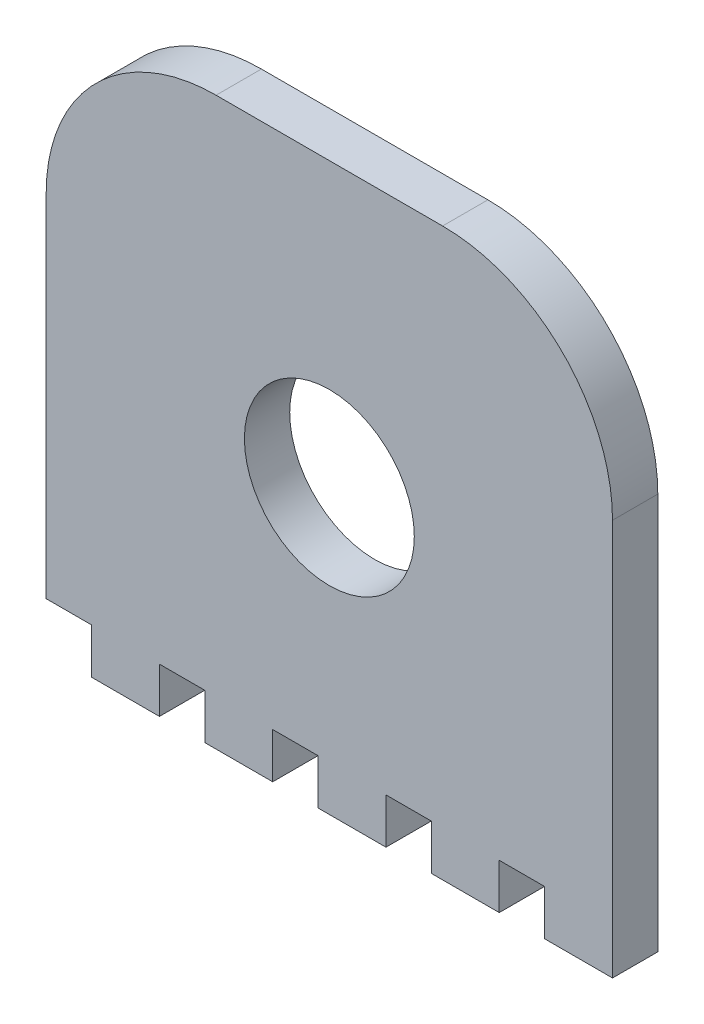
ISO-10303-21;
HEADER;
FILE_DESCRIPTION(('STEP AP214'),'2;1');
FILE_NAME('part.step','',(''),(''),'','','');
FILE_SCHEMA(('AUTOMOTIVE_DESIGN { 1 0 10303 214 1 1 1 1 }'));
ENDSEC;
DATA;
#1=APPLICATION_CONTEXT('core data for automotive mechanical design processes');
#2=APPLICATION_PROTOCOL_DEFINITION('international standard','automotive_design',2000,#1);
#3=PRODUCT_CONTEXT('',#1,'mechanical');
#4=PRODUCT('Part','Part','',(#3));
#5=PRODUCT_RELATED_PRODUCT_CATEGORY('part','',(#4));
#6=PRODUCT_DEFINITION_FORMATION('','',#4);
#7=PRODUCT_DEFINITION_CONTEXT('part definition',#1,'design');
#8=PRODUCT_DEFINITION('design','',#6,#7);
#9=PRODUCT_DEFINITION_SHAPE('','',#8);
#10=(LENGTH_UNIT() NAMED_UNIT(*) SI_UNIT(.MILLI.,.METRE.));
#11=(NAMED_UNIT(*) PLANE_ANGLE_UNIT() SI_UNIT($,.RADIAN.));
#12=(NAMED_UNIT(*) SI_UNIT($,.STERADIAN.) SOLID_ANGLE_UNIT());
#13=UNCERTAINTY_MEASURE_WITH_UNIT(LENGTH_MEASURE(1.E-05),#10,'distance_accuracy_value','');
#14=(GEOMETRIC_REPRESENTATION_CONTEXT(3) GLOBAL_UNCERTAINTY_ASSIGNED_CONTEXT((#13)) GLOBAL_UNIT_ASSIGNED_CONTEXT((#10,
#11,#12)) REPRESENTATION_CONTEXT('',''));
#15=CARTESIAN_POINT('',(0.,0.,0.));
#16=DIRECTION('',(0.,0.,1.));
#17=DIRECTION('',(1.,0.,0.));
#18=AXIS2_PLACEMENT_3D('',#15,#16,#17);
#19=CARTESIAN_POINT('',(-25.,-25.,4.));
#20=DIRECTION('',(0.,1.,0.));
#21=DIRECTION('',(0.,0.,1.));
#22=AXIS2_PLACEMENT_3D('',#19,#20,#21);
#23=PLANE('',#22);
#24=DIRECTION('',(0.,0.,-1.));
#25=VECTOR('',#24,1.);
#26=CARTESIAN_POINT('',(-15.,-25.,4.));
#27=LINE('',#26,#25);
#28=CARTESIAN_POINT('',(-15.,-25.,4.));
#29=VERTEX_POINT('',#28);
#30=CARTESIAN_POINT('',(-15.,-25.,0.));
#31=VERTEX_POINT('',#30);
#32=EDGE_CURVE('E199',#29,#31,#27,.T.);
#33=ORIENTED_EDGE('',*,*,#32,.F.);
#34=DIRECTION('',(1.,0.,0.));
#35=VECTOR('',#34,1.);
#36=CARTESIAN_POINT('',(-25.,-25.,4.));
#37=LINE('',#36,#35);
#38=CARTESIAN_POINT('',(-21.,-25.,4.));
#39=VERTEX_POINT('',#38);
#40=EDGE_CURVE('E212',#39,#29,#37,.T.);
#41=ORIENTED_EDGE('',*,*,#40,.F.);
#42=DIRECTION('',(0.,0.,-1.));
#43=VECTOR('',#42,1.);
#44=CARTESIAN_POINT('',(-21.,-25.,4.));
#45=LINE('',#44,#43);
#46=CARTESIAN_POINT('',(-21.,-25.,0.));
#47=VERTEX_POINT('',#46);
#48=EDGE_CURVE('E245',#39,#47,#45,.T.);
#49=ORIENTED_EDGE('',*,*,#48,.T.);
#50=DIRECTION('',(1.,0.,0.));
#51=VECTOR('',#50,1.);
#52=CARTESIAN_POINT('',(-25.,-25.,0.));
#53=LINE('',#52,#51);
#54=EDGE_CURVE('E214',#47,#31,#53,.T.);
#55=ORIENTED_EDGE('',*,*,#54,.T.);
#56=EDGE_LOOP('',(#33,#41,#49,#55));
#57=FACE_BOUND('',#56,.T.);
#58=ADVANCED_FACE('F32',(#57),#23,.F.);
#59=DIRECTION('',(0.,0.,-1.));
#60=VECTOR('',#59,1.);
#61=CARTESIAN_POINT('',(-11.,-25.,4.));
#62=LINE('',#61,#60);
#63=CARTESIAN_POINT('',(-11.,-25.,4.));
#64=VERTEX_POINT('',#63);
#65=CARTESIAN_POINT('',(-11.,-25.,0.));
#66=VERTEX_POINT('',#65);
#67=EDGE_CURVE('E216',#64,#66,#62,.T.);
#68=ORIENTED_EDGE('',*,*,#67,.T.);
#69=CARTESIAN_POINT('',(-5.,-25.,0.));
#70=VERTEX_POINT('',#69);
#71=EDGE_CURVE('E419',#66,#70,#53,.T.);
#72=ORIENTED_EDGE('',*,*,#71,.T.);
#73=DIRECTION('',(0.,0.,-1.));
#74=VECTOR('',#73,1.);
#75=CARTESIAN_POINT('',(-5.,-25.,4.));
#76=LINE('',#75,#74);
#77=CARTESIAN_POINT('',(-5.,-25.,4.));
#78=VERTEX_POINT('',#77);
#79=EDGE_CURVE('E313',#78,#70,#76,.T.);
#80=ORIENTED_EDGE('',*,*,#79,.F.);
#81=EDGE_CURVE('E223',#64,#78,#37,.T.);
#82=ORIENTED_EDGE('',*,*,#81,.F.);
#83=EDGE_LOOP('',(#68,#72,#80,#82));
#84=FACE_BOUND('',#83,.T.);
#85=ADVANCED_FACE('F377',(#84),#23,.F.);
#86=DIRECTION('',(0.,0.,-1.));
#87=VECTOR('',#86,1.);
#88=CARTESIAN_POINT('',(-0.999999999999997,-25.,4.));
#89=LINE('',#88,#87);
#90=CARTESIAN_POINT('',(-0.999999999999997,-25.,4.));
#91=VERTEX_POINT('',#90);
#92=CARTESIAN_POINT('',(-0.999999999999997,-25.,0.));
#93=VERTEX_POINT('',#92);
#94=EDGE_CURVE('E316',#91,#93,#89,.T.);
#95=ORIENTED_EDGE('',*,*,#94,.T.);
#96=CARTESIAN_POINT('',(5.,-25.,0.));
#97=VERTEX_POINT('',#96);
#98=EDGE_CURVE('E465',#93,#97,#53,.T.);
#99=ORIENTED_EDGE('',*,*,#98,.T.);
#100=DIRECTION('',(0.,0.,-1.));
#101=VECTOR('',#100,1.);
#102=CARTESIAN_POINT('',(5.,-25.,4.));
#103=LINE('',#102,#101);
#104=CARTESIAN_POINT('',(5.,-25.,4.));
#105=VERTEX_POINT('',#104);
#106=EDGE_CURVE('E288',#105,#97,#103,.T.);
#107=ORIENTED_EDGE('',*,*,#106,.F.);
#108=EDGE_CURVE('E230',#91,#105,#37,.T.);
#109=ORIENTED_EDGE('',*,*,#108,.F.);
#110=EDGE_LOOP('',(#95,#99,#107,#109));
#111=FACE_BOUND('',#110,.T.);
#112=ADVANCED_FACE('F381',(#111),#23,.F.);
#113=DIRECTION('',(0.,0.,-1.));
#114=VECTOR('',#113,1.);
#115=CARTESIAN_POINT('',(9.,-25.,4.));
#116=LINE('',#115,#114);
#117=CARTESIAN_POINT('',(9.,-25.,4.));
#118=VERTEX_POINT('',#117);
#119=CARTESIAN_POINT('',(9.,-25.,0.));
#120=VERTEX_POINT('',#119);
#121=EDGE_CURVE('E291',#118,#120,#116,.T.);
#122=ORIENTED_EDGE('',*,*,#121,.T.);
#123=CARTESIAN_POINT('',(15.,-25.,0.));
#124=VERTEX_POINT('',#123);
#125=EDGE_CURVE('E482',#120,#124,#53,.T.);
#126=ORIENTED_EDGE('',*,*,#125,.T.);
#127=DIRECTION('',(0.,0.,-1.));
#128=VECTOR('',#127,1.);
#129=CARTESIAN_POINT('',(15.,-25.,4.));
#130=LINE('',#129,#128);
#131=CARTESIAN_POINT('',(15.,-25.,4.));
#132=VERTEX_POINT('',#131);
#133=EDGE_CURVE('E261',#132,#124,#130,.T.);
#134=ORIENTED_EDGE('',*,*,#133,.F.);
#135=EDGE_CURVE('E233',#118,#132,#37,.T.);
#136=ORIENTED_EDGE('',*,*,#135,.F.);
#137=EDGE_LOOP('',(#122,#126,#134,#136));
#138=FACE_BOUND('',#137,.T.);
#139=ADVANCED_FACE('F372',(#138),#23,.F.);
#140=DIRECTION('',(0.,0.,-1.));
#141=VECTOR('',#140,1.);
#142=CARTESIAN_POINT('',(19.,-25.,4.));
#143=LINE('',#142,#141);
#144=CARTESIAN_POINT('',(19.,-25.,4.));
#145=VERTEX_POINT('',#144);
#146=CARTESIAN_POINT('',(19.,-25.,0.));
#147=VERTEX_POINT('',#146);
#148=EDGE_CURVE('E264',#145,#147,#143,.T.);
#149=ORIENTED_EDGE('',*,*,#148,.T.);
#150=CARTESIAN_POINT('',(25.,-25.,0.));
#151=VERTEX_POINT('',#150);
#152=EDGE_CURVE('E420',#147,#151,#53,.T.);
#153=ORIENTED_EDGE('',*,*,#152,.T.);
#154=DIRECTION('',(0.,0.,-1.));
#155=VECTOR('',#154,1.);
#156=CARTESIAN_POINT('',(25.,-25.,4.));
#157=LINE('',#156,#155);
#158=CARTESIAN_POINT('',(25.,-25.,4.));
#159=VERTEX_POINT('',#158);
#160=EDGE_CURVE('E222',#159,#151,#157,.T.);
#161=ORIENTED_EDGE('',*,*,#160,.F.);
#162=EDGE_CURVE('E225',#145,#159,#37,.T.);
#163=ORIENTED_EDGE('',*,*,#162,.F.);
#164=EDGE_LOOP('',(#149,#153,#161,#163));
#165=FACE_BOUND('',#164,.T.);
#166=ADVANCED_FACE('F363',(#165),#23,.F.);
#167=CARTESIAN_POINT('',(0.,0.,4.));
#168=DIRECTION('',(0.,0.,-1.));
#169=DIRECTION('',(-1.,0.,0.));
#170=AXIS2_PLACEMENT_3D('',#167,#168,#169);
#171=PLANE('',#170);
#172=CARTESIAN_POINT('',(0.,0.,4.));
#173=DIRECTION('',(0.,0.,1.));
#174=DIRECTION('',(1.,0.,0.));
#175=AXIS2_PLACEMENT_3D('',#172,#173,#174);
#176=CIRCLE('',#175,7.5);
#177=CARTESIAN_POINT('',(7.5,0.,4.));
#178=VERTEX_POINT('',#177);
#179=EDGE_CURVE('E283',#178,#178,#176,.T.);
#180=ORIENTED_EDGE('',*,*,#179,.F.);
#181=EDGE_LOOP('',(#180));
#182=FACE_BOUND('',#181,.T.);
#183=DIRECTION('',(0.,1.,0.));
#184=VECTOR('',#183,1.);
#185=CARTESIAN_POINT('',(25.,-25.,4.));
#186=LINE('',#185,#184);
#187=CARTESIAN_POINT('',(25.,10.,4.));
#188=VERTEX_POINT('',#187);
#189=EDGE_CURVE('E241',#159,#188,#186,.T.);
#190=ORIENTED_EDGE('',*,*,#189,.T.);
#191=CARTESIAN_POINT('',(10.,10.,4.));
#192=DIRECTION('',(0.,0.,-1.));
#193=DIRECTION('',(-1.,0.,0.));
#194=AXIS2_PLACEMENT_3D('',#191,#192,#193);
#195=CIRCLE('',#194,15.);
#196=CARTESIAN_POINT('',(10.,25.,4.));
#197=VERTEX_POINT('',#196);
#198=EDGE_CURVE('E40',#188,#197,#195,.F.);
#199=ORIENTED_EDGE('',*,*,#198,.T.);
#200=DIRECTION('',(-1.,0.,0.));
#201=VECTOR('',#200,1.);
#202=CARTESIAN_POINT('',(-25.,25.,4.));
#203=LINE('',#202,#201);
#204=CARTESIAN_POINT('',(-10.,25.,4.));
#205=VERTEX_POINT('',#204);
#206=EDGE_CURVE('E239',#197,#205,#203,.T.);
#207=ORIENTED_EDGE('',*,*,#206,.T.);
#208=CARTESIAN_POINT('',(-10.,10.,4.));
#209=DIRECTION('',(0.,0.,-1.));
#210=DIRECTION('',(-1.,0.,0.));
#211=AXIS2_PLACEMENT_3D('',#208,#209,#210);
#212=CIRCLE('',#211,15.);
#213=CARTESIAN_POINT('',(-25.,10.,4.));
#214=VERTEX_POINT('',#213);
#215=EDGE_CURVE('E47',#205,#214,#212,.F.);
#216=ORIENTED_EDGE('',*,*,#215,.T.);
#217=DIRECTION('',(0.,-1.,0.));
#218=VECTOR('',#217,1.);
#219=CARTESIAN_POINT('',(-25.,-25.,4.));
#220=LINE('',#219,#218);
#221=CARTESIAN_POINT('',(-25.,-21.,4.));
#222=VERTEX_POINT('',#221);
#223=EDGE_CURVE('E234',#214,#222,#220,.T.);
#224=ORIENTED_EDGE('',*,*,#223,.T.);
#225=DIRECTION('',(-1.,0.,0.));
#226=VECTOR('',#225,1.);
#227=CARTESIAN_POINT('',(-25.,-21.,4.));
#228=LINE('',#227,#226);
#229=CARTESIAN_POINT('',(-21.,-21.,4.));
#230=VERTEX_POINT('',#229);
#231=EDGE_CURVE('E253',#230,#222,#228,.T.);
#232=ORIENTED_EDGE('',*,*,#231,.F.);
#233=DIRECTION('',(0.,1.,0.));
#234=VECTOR('',#233,1.);
#235=CARTESIAN_POINT('',(-21.,-25.,4.));
#236=LINE('',#235,#234);
#237=EDGE_CURVE('E221',#39,#230,#236,.T.);
#238=ORIENTED_EDGE('',*,*,#237,.F.);
#239=ORIENTED_EDGE('',*,*,#40,.T.);
#240=DIRECTION('',(0.,-1.,0.));
#241=VECTOR('',#240,1.);
#242=CARTESIAN_POINT('',(-15.,-25.,4.));
#243=LINE('',#242,#241);
#244=CARTESIAN_POINT('',(-15.,-21.,4.));
#245=VERTEX_POINT('',#244);
#246=EDGE_CURVE('E196',#245,#29,#243,.T.);
#247=ORIENTED_EDGE('',*,*,#246,.F.);
#248=DIRECTION('',(-1.,0.,0.));
#249=VECTOR('',#248,1.);
#250=CARTESIAN_POINT('',(-15.,-21.,4.));
#251=LINE('',#250,#249);
#252=CARTESIAN_POINT('',(-11.,-21.,4.));
#253=VERTEX_POINT('',#252);
#254=EDGE_CURVE('E343',#253,#245,#251,.T.);
#255=ORIENTED_EDGE('',*,*,#254,.F.);
#256=DIRECTION('',(0.,1.,0.));
#257=VECTOR('',#256,1.);
#258=CARTESIAN_POINT('',(-11.,-25.,4.));
#259=LINE('',#258,#257);
#260=EDGE_CURVE('E205',#64,#253,#259,.T.);
#261=ORIENTED_EDGE('',*,*,#260,.F.);
#262=ORIENTED_EDGE('',*,*,#81,.T.);
#263=DIRECTION('',(0.,-1.,0.));
#264=VECTOR('',#263,1.);
#265=CARTESIAN_POINT('',(-5.,-25.,4.));
#266=LINE('',#265,#264);
#267=CARTESIAN_POINT('',(-5.,-21.,4.));
#268=VERTEX_POINT('',#267);
#269=EDGE_CURVE('E328',#268,#78,#266,.T.);
#270=ORIENTED_EDGE('',*,*,#269,.F.);
#271=DIRECTION('',(-1.,0.,0.));
#272=VECTOR('',#271,1.);
#273=CARTESIAN_POINT('',(-5.,-21.,4.));
#274=LINE('',#273,#272);
#275=CARTESIAN_POINT('',(-0.999999999999997,-21.,4.));
#276=VERTEX_POINT('',#275);
#277=EDGE_CURVE('E324',#276,#268,#274,.T.);
#278=ORIENTED_EDGE('',*,*,#277,.F.);
#279=DIRECTION('',(0.,1.,0.));
#280=VECTOR('',#279,1.);
#281=CARTESIAN_POINT('',(-0.999999999999997,-25.,4.));
#282=LINE('',#281,#280);
#283=EDGE_CURVE('E335',#91,#276,#282,.T.);
#284=ORIENTED_EDGE('',*,*,#283,.F.);
#285=ORIENTED_EDGE('',*,*,#108,.T.);
#286=DIRECTION('',(0.,-1.,0.));
#287=VECTOR('',#286,1.);
#288=CARTESIAN_POINT('',(5.,-25.,4.));
#289=LINE('',#288,#287);
#290=CARTESIAN_POINT('',(5.,-21.,4.));
#291=VERTEX_POINT('',#290);
#292=EDGE_CURVE('E303',#291,#105,#289,.T.);
#293=ORIENTED_EDGE('',*,*,#292,.F.);
#294=DIRECTION('',(-1.,0.,0.));
#295=VECTOR('',#294,1.);
#296=CARTESIAN_POINT('',(5.,-21.,4.));
#297=LINE('',#296,#295);
#298=CARTESIAN_POINT('',(9.,-21.,4.));
#299=VERTEX_POINT('',#298);
#300=EDGE_CURVE('E299',#299,#291,#297,.T.);
#301=ORIENTED_EDGE('',*,*,#300,.F.);
#302=DIRECTION('',(0.,1.,0.));
#303=VECTOR('',#302,1.);
#304=CARTESIAN_POINT('',(9.,-25.,4.));
#305=LINE('',#304,#303);
#306=EDGE_CURVE('E310',#118,#299,#305,.T.);
#307=ORIENTED_EDGE('',*,*,#306,.F.);
#308=ORIENTED_EDGE('',*,*,#135,.T.);
#309=DIRECTION('',(0.,-1.,0.));
#310=VECTOR('',#309,1.);
#311=CARTESIAN_POINT('',(15.,-25.,4.));
#312=LINE('',#311,#310);
#313=CARTESIAN_POINT('',(15.,-21.,4.));
#314=VERTEX_POINT('',#313);
#315=EDGE_CURVE('E276',#314,#132,#312,.T.);
#316=ORIENTED_EDGE('',*,*,#315,.F.);
#317=DIRECTION('',(-1.,0.,0.));
#318=VECTOR('',#317,1.);
#319=CARTESIAN_POINT('',(15.,-21.,4.));
#320=LINE('',#319,#318);
#321=CARTESIAN_POINT('',(19.,-21.,4.));
#322=VERTEX_POINT('',#321);
#323=EDGE_CURVE('E272',#322,#314,#320,.T.);
#324=ORIENTED_EDGE('',*,*,#323,.F.);
#325=DIRECTION('',(0.,1.,0.));
#326=VECTOR('',#325,1.);
#327=CARTESIAN_POINT('',(19.,-25.,4.));
#328=LINE('',#327,#326);
#329=EDGE_CURVE('E285',#145,#322,#328,.T.);
#330=ORIENTED_EDGE('',*,*,#329,.F.);
#331=ORIENTED_EDGE('',*,*,#162,.T.);
#332=EDGE_LOOP('',(#190,#199,#207,#216,#224,#232,#238,#239,#247,#255,#261,#262,#270,#278,#284,
#285,#293,#301,#307,#308,#316,#324,#330,#331));
#333=FACE_BOUND('',#332,.T.);
#334=ADVANCED_FACE('F219',(#182,#333),#171,.F.);
#335=CARTESIAN_POINT('',(0.,0.,0.));
#336=DIRECTION('',(0.,0.,-1.));
#337=DIRECTION('',(-1.,0.,0.));
#338=AXIS2_PLACEMENT_3D('',#335,#336,#337);
#339=PLANE('',#338);
#340=CARTESIAN_POINT('',(0.,0.,0.));
#341=DIRECTION('',(0.,0.,1.));
#342=DIRECTION('',(1.,0.,0.));
#343=AXIS2_PLACEMENT_3D('',#340,#341,#342);
#344=CIRCLE('',#343,7.5);
#345=CARTESIAN_POINT('',(7.5,0.,0.));
#346=VERTEX_POINT('',#345);
#347=EDGE_CURVE('E352',#346,#346,#344,.T.);
#348=ORIENTED_EDGE('',*,*,#347,.T.);
#349=EDGE_LOOP('',(#348));
#350=FACE_BOUND('',#349,.T.);
#351=DIRECTION('',(-1.,0.,0.));
#352=VECTOR('',#351,1.);
#353=CARTESIAN_POINT('',(-25.,25.,0.));
#354=LINE('',#353,#352);
#355=CARTESIAN_POINT('',(10.,25.,0.));
#356=VERTEX_POINT('',#355);
#357=CARTESIAN_POINT('',(-10.,25.,0.));
#358=VERTEX_POINT('',#357);
#359=EDGE_CURVE('E423',#356,#358,#354,.T.);
#360=ORIENTED_EDGE('',*,*,#359,.F.);
#361=CARTESIAN_POINT('',(10.,10.,0.));
#362=DIRECTION('',(0.,0.,-1.));
#363=DIRECTION('',(-1.,0.,0.));
#364=AXIS2_PLACEMENT_3D('',#361,#362,#363);
#365=CIRCLE('',#364,15.);
#366=CARTESIAN_POINT('',(25.,10.,0.));
#367=VERTEX_POINT('',#366);
#368=EDGE_CURVE('E412',#356,#367,#365,.T.);
#369=ORIENTED_EDGE('',*,*,#368,.T.);
#370=DIRECTION('',(0.,1.,0.));
#371=VECTOR('',#370,1.);
#372=CARTESIAN_POINT('',(25.,-25.,0.));
#373=LINE('',#372,#371);
#374=EDGE_CURVE('E247',#151,#367,#373,.T.);
#375=ORIENTED_EDGE('',*,*,#374,.F.);
#376=ORIENTED_EDGE('',*,*,#152,.F.);
#377=DIRECTION('',(0.,1.,0.));
#378=VECTOR('',#377,1.);
#379=CARTESIAN_POINT('',(19.,-25.,0.));
#380=LINE('',#379,#378);
#381=CARTESIAN_POINT('',(19.,-21.,0.));
#382=VERTEX_POINT('',#381);
#383=EDGE_CURVE('E277',#147,#382,#380,.T.);
#384=ORIENTED_EDGE('',*,*,#383,.T.);
#385=DIRECTION('',(-1.,0.,0.));
#386=VECTOR('',#385,1.);
#387=CARTESIAN_POINT('',(15.,-21.,0.));
#388=LINE('',#387,#386);
#389=CARTESIAN_POINT('',(15.,-21.,0.));
#390=VERTEX_POINT('',#389);
#391=EDGE_CURVE('E273',#382,#390,#388,.T.);
#392=ORIENTED_EDGE('',*,*,#391,.T.);
#393=DIRECTION('',(0.,-1.,0.));
#394=VECTOR('',#393,1.);
#395=CARTESIAN_POINT('',(15.,-25.,0.));
#396=LINE('',#395,#394);
#397=EDGE_CURVE('E280',#390,#124,#396,.T.);
#398=ORIENTED_EDGE('',*,*,#397,.T.);
#399=ORIENTED_EDGE('',*,*,#125,.F.);
#400=DIRECTION('',(0.,1.,0.));
#401=VECTOR('',#400,1.);
#402=CARTESIAN_POINT('',(9.,-25.,0.));
#403=LINE('',#402,#401);
#404=CARTESIAN_POINT('',(9.,-21.,0.));
#405=VERTEX_POINT('',#404);
#406=EDGE_CURVE('E304',#120,#405,#403,.T.);
#407=ORIENTED_EDGE('',*,*,#406,.T.);
#408=DIRECTION('',(-1.,0.,0.));
#409=VECTOR('',#408,1.);
#410=CARTESIAN_POINT('',(5.,-21.,0.));
#411=LINE('',#410,#409);
#412=CARTESIAN_POINT('',(5.,-21.,0.));
#413=VERTEX_POINT('',#412);
#414=EDGE_CURVE('E300',#405,#413,#411,.T.);
#415=ORIENTED_EDGE('',*,*,#414,.T.);
#416=DIRECTION('',(0.,-1.,0.));
#417=VECTOR('',#416,1.);
#418=CARTESIAN_POINT('',(5.,-25.,0.));
#419=LINE('',#418,#417);
#420=EDGE_CURVE('E263',#413,#97,#419,.T.);
#421=ORIENTED_EDGE('',*,*,#420,.T.);
#422=ORIENTED_EDGE('',*,*,#98,.F.);
#423=DIRECTION('',(0.,1.,0.));
#424=VECTOR('',#423,1.);
#425=CARTESIAN_POINT('',(-0.999999999999997,-25.,0.));
#426=LINE('',#425,#424);
#427=CARTESIAN_POINT('',(-0.999999999999997,-21.,0.));
#428=VERTEX_POINT('',#427);
#429=EDGE_CURVE('E329',#93,#428,#426,.T.);
#430=ORIENTED_EDGE('',*,*,#429,.T.);
#431=DIRECTION('',(-1.,0.,0.));
#432=VECTOR('',#431,1.);
#433=CARTESIAN_POINT('',(-5.,-21.,0.));
#434=LINE('',#433,#432);
#435=CARTESIAN_POINT('',(-5.,-21.,0.));
#436=VERTEX_POINT('',#435);
#437=EDGE_CURVE('E325',#428,#436,#434,.T.);
#438=ORIENTED_EDGE('',*,*,#437,.T.);
#439=DIRECTION('',(0.,-1.,0.));
#440=VECTOR('',#439,1.);
#441=CARTESIAN_POINT('',(-5.,-25.,0.));
#442=LINE('',#441,#440);
#443=EDGE_CURVE('E290',#436,#70,#442,.T.);
#444=ORIENTED_EDGE('',*,*,#443,.T.);
#445=ORIENTED_EDGE('',*,*,#71,.F.);
#446=DIRECTION('',(0.,1.,0.));
#447=VECTOR('',#446,1.);
#448=CARTESIAN_POINT('',(-11.,-25.,0.));
#449=LINE('',#448,#447);
#450=CARTESIAN_POINT('',(-11.,-21.,0.));
#451=VERTEX_POINT('',#450);
#452=EDGE_CURVE('E346',#66,#451,#449,.T.);
#453=ORIENTED_EDGE('',*,*,#452,.T.);
#454=DIRECTION('',(-1.,0.,0.));
#455=VECTOR('',#454,1.);
#456=CARTESIAN_POINT('',(-15.,-21.,0.));
#457=LINE('',#456,#455);
#458=CARTESIAN_POINT('',(-15.,-21.,0.));
#459=VERTEX_POINT('',#458);
#460=EDGE_CURVE('E206',#451,#459,#457,.T.);
#461=ORIENTED_EDGE('',*,*,#460,.T.);
#462=DIRECTION('',(0.,-1.,0.));
#463=VECTOR('',#462,1.);
#464=CARTESIAN_POINT('',(-15.,-25.,0.));
#465=LINE('',#464,#463);
#466=EDGE_CURVE('E315',#459,#31,#465,.T.);
#467=ORIENTED_EDGE('',*,*,#466,.T.);
#468=ORIENTED_EDGE('',*,*,#54,.F.);
#469=DIRECTION('',(0.,1.,0.));
#470=VECTOR('',#469,1.);
#471=CARTESIAN_POINT('',(-21.,-25.,0.));
#472=LINE('',#471,#470);
#473=CARTESIAN_POINT('',(-21.,-21.,0.));
#474=VERTEX_POINT('',#473);
#475=EDGE_CURVE('E215',#47,#474,#472,.T.);
#476=ORIENTED_EDGE('',*,*,#475,.T.);
#477=DIRECTION('',(-1.,0.,0.));
#478=VECTOR('',#477,1.);
#479=CARTESIAN_POINT('',(-25.,-21.,0.));
#480=LINE('',#479,#478);
#481=CARTESIAN_POINT('',(-25.,-21.,0.));
#482=VERTEX_POINT('',#481);
#483=EDGE_CURVE('E254',#474,#482,#480,.T.);
#484=ORIENTED_EDGE('',*,*,#483,.T.);
#485=DIRECTION('',(0.,-1.,0.));
#486=VECTOR('',#485,1.);
#487=CARTESIAN_POINT('',(-25.,-25.,0.));
#488=LINE('',#487,#486);
#489=CARTESIAN_POINT('',(-25.,10.,0.));
#490=VERTEX_POINT('',#489);
#491=EDGE_CURVE('E421',#490,#482,#488,.T.);
#492=ORIENTED_EDGE('',*,*,#491,.F.);
#493=CARTESIAN_POINT('',(-10.,10.,0.));
#494=DIRECTION('',(0.,0.,-1.));
#495=DIRECTION('',(-1.,0.,0.));
#496=AXIS2_PLACEMENT_3D('',#493,#494,#495);
#497=CIRCLE('',#496,15.);
#498=EDGE_CURVE('E414',#490,#358,#497,.T.);
#499=ORIENTED_EDGE('',*,*,#498,.T.);
#500=EDGE_LOOP('',(#360,#369,#375,#376,#384,#392,#398,#399,#407,#415,#421,#422,#430,#438,#444,
#445,#453,#461,#467,#468,#476,#484,#492,#499));
#501=FACE_BOUND('',#500,.T.);
#502=ADVANCED_FACE('F362',(#350,#501),#339,.T.);
#503=CARTESIAN_POINT('',(-25.,-25.,4.));
#504=DIRECTION('',(1.,0.,0.));
#505=DIRECTION('',(0.,0.,-1.));
#506=AXIS2_PLACEMENT_3D('',#503,#504,#505);
#507=PLANE('',#506);
#508=ORIENTED_EDGE('',*,*,#223,.F.);
#509=DIRECTION('',(0.,0.,-1.));
#510=VECTOR('',#509,1.);
#511=CARTESIAN_POINT('',(-25.,10.,4.));
#512=LINE('',#511,#510);
#513=EDGE_CURVE('E11',#214,#490,#512,.T.);
#514=ORIENTED_EDGE('',*,*,#513,.T.);
#515=ORIENTED_EDGE('',*,*,#491,.T.);
#516=DIRECTION('',(0.,0.,-1.));
#517=VECTOR('',#516,1.);
#518=CARTESIAN_POINT('',(-25.,-21.,4.));
#519=LINE('',#518,#517);
#520=EDGE_CURVE('E250',#222,#482,#519,.T.);
#521=ORIENTED_EDGE('',*,*,#520,.F.);
#522=EDGE_LOOP('',(#508,#514,#515,#521));
#523=FACE_BOUND('',#522,.T.);
#524=ADVANCED_FACE('F369',(#523),#507,.F.);
#525=CARTESIAN_POINT('',(25.,-25.,4.));
#526=DIRECTION('',(-1.,0.,0.));
#527=DIRECTION('',(0.,0.,1.));
#528=AXIS2_PLACEMENT_3D('',#525,#526,#527);
#529=PLANE('',#528);
#530=ORIENTED_EDGE('',*,*,#374,.T.);
#531=DIRECTION('',(0.,0.,-1.));
#532=VECTOR('',#531,1.);
#533=CARTESIAN_POINT('',(25.,10.,4.));
#534=LINE('',#533,#532);
#535=EDGE_CURVE('E55',#367,#188,#534,.F.);
#536=ORIENTED_EDGE('',*,*,#535,.T.);
#537=ORIENTED_EDGE('',*,*,#189,.F.);
#538=ORIENTED_EDGE('',*,*,#160,.T.);
#539=EDGE_LOOP('',(#530,#536,#537,#538));
#540=FACE_BOUND('',#539,.T.);
#541=ADVANCED_FACE('F386',(#540),#529,.F.);
#542=CARTESIAN_POINT('',(-25.,25.,4.));
#543=DIRECTION('',(0.,-1.,0.));
#544=DIRECTION('',(0.,0.,-1.));
#545=AXIS2_PLACEMENT_3D('',#542,#543,#544);
#546=PLANE('',#545);
#547=ORIENTED_EDGE('',*,*,#206,.F.);
#548=DIRECTION('',(0.,0.,-1.));
#549=VECTOR('',#548,1.);
#550=CARTESIAN_POINT('',(10.,25.,4.));
#551=LINE('',#550,#549);
#552=EDGE_CURVE('E407',#197,#356,#551,.T.);
#553=ORIENTED_EDGE('',*,*,#552,.T.);
#554=ORIENTED_EDGE('',*,*,#359,.T.);
#555=DIRECTION('',(0.,0.,-1.));
#556=VECTOR('',#555,1.);
#557=CARTESIAN_POINT('',(-10.,25.,4.));
#558=LINE('',#557,#556);
#559=EDGE_CURVE('E227',#358,#205,#558,.F.);
#560=ORIENTED_EDGE('',*,*,#559,.T.);
#561=EDGE_LOOP('',(#547,#553,#554,#560));
#562=FACE_BOUND('',#561,.T.);
#563=ADVANCED_FACE('F388',(#562),#546,.F.);
#564=CARTESIAN_POINT('',(-21.,-25.,4.));
#565=DIRECTION('',(-1.,0.,0.));
#566=DIRECTION('',(0.,0.,1.));
#567=AXIS2_PLACEMENT_3D('',#564,#565,#566);
#568=PLANE('',#567);
#569=ORIENTED_EDGE('',*,*,#475,.F.);
#570=ORIENTED_EDGE('',*,*,#48,.F.);
#571=ORIENTED_EDGE('',*,*,#237,.T.);
#572=DIRECTION('',(0.,0.,-1.));
#573=VECTOR('',#572,1.);
#574=CARTESIAN_POINT('',(-21.,-21.,4.));
#575=LINE('',#574,#573);
#576=EDGE_CURVE('E248',#230,#474,#575,.T.);
#577=ORIENTED_EDGE('',*,*,#576,.T.);
#578=EDGE_LOOP('',(#569,#570,#571,#577));
#579=FACE_BOUND('',#578,.T.);
#580=ADVANCED_FACE('F391',(#579),#568,.T.);
#581=CARTESIAN_POINT('',(-25.,-21.,4.));
#582=DIRECTION('',(0.,-1.,0.));
#583=DIRECTION('',(0.,0.,-1.));
#584=AXIS2_PLACEMENT_3D('',#581,#582,#583);
#585=PLANE('',#584);
#586=ORIENTED_EDGE('',*,*,#483,.F.);
#587=ORIENTED_EDGE('',*,*,#576,.F.);
#588=ORIENTED_EDGE('',*,*,#231,.T.);
#589=ORIENTED_EDGE('',*,*,#520,.T.);
#590=EDGE_LOOP('',(#586,#587,#588,#589));
#591=FACE_BOUND('',#590,.T.);
#592=ADVANCED_FACE('F436',(#591),#585,.T.);
#593=CARTESIAN_POINT('',(15.,-25.,4.));
#594=DIRECTION('',(1.,0.,0.));
#595=DIRECTION('',(0.,0.,-1.));
#596=AXIS2_PLACEMENT_3D('',#593,#594,#595);
#597=PLANE('',#596);
#598=ORIENTED_EDGE('',*,*,#397,.F.);
#599=DIRECTION('',(0.,0.,-1.));
#600=VECTOR('',#599,1.);
#601=CARTESIAN_POINT('',(15.,-21.,4.));
#602=LINE('',#601,#600);
#603=EDGE_CURVE('E269',#314,#390,#602,.T.);
#604=ORIENTED_EDGE('',*,*,#603,.F.);
#605=ORIENTED_EDGE('',*,*,#315,.T.);
#606=ORIENTED_EDGE('',*,*,#133,.T.);
#607=EDGE_LOOP('',(#598,#604,#605,#606));
#608=FACE_BOUND('',#607,.T.);
#609=ADVANCED_FACE('F484',(#608),#597,.T.);
#610=CARTESIAN_POINT('',(19.,-25.,4.));
#611=DIRECTION('',(-1.,0.,0.));
#612=DIRECTION('',(0.,0.,1.));
#613=AXIS2_PLACEMENT_3D('',#610,#611,#612);
#614=PLANE('',#613);
#615=ORIENTED_EDGE('',*,*,#383,.F.);
#616=ORIENTED_EDGE('',*,*,#148,.F.);
#617=ORIENTED_EDGE('',*,*,#329,.T.);
#618=DIRECTION('',(0.,0.,-1.));
#619=VECTOR('',#618,1.);
#620=CARTESIAN_POINT('',(19.,-21.,4.));
#621=LINE('',#620,#619);
#622=EDGE_CURVE('E267',#322,#382,#621,.T.);
#623=ORIENTED_EDGE('',*,*,#622,.T.);
#624=EDGE_LOOP('',(#615,#616,#617,#623));
#625=FACE_BOUND('',#624,.T.);
#626=ADVANCED_FACE('F492',(#625),#614,.T.);
#627=CARTESIAN_POINT('',(15.,-21.,4.));
#628=DIRECTION('',(0.,-1.,0.));
#629=DIRECTION('',(0.,0.,-1.));
#630=AXIS2_PLACEMENT_3D('',#627,#628,#629);
#631=PLANE('',#630);
#632=ORIENTED_EDGE('',*,*,#391,.F.);
#633=ORIENTED_EDGE('',*,*,#622,.F.);
#634=ORIENTED_EDGE('',*,*,#323,.T.);
#635=ORIENTED_EDGE('',*,*,#603,.T.);
#636=EDGE_LOOP('',(#632,#633,#634,#635));
#637=FACE_BOUND('',#636,.T.);
#638=ADVANCED_FACE('F489',(#637),#631,.T.);
#639=CARTESIAN_POINT('',(5.,-25.,4.));
#640=DIRECTION('',(1.,0.,0.));
#641=DIRECTION('',(0.,0.,-1.));
#642=AXIS2_PLACEMENT_3D('',#639,#640,#641);
#643=PLANE('',#642);
#644=ORIENTED_EDGE('',*,*,#420,.F.);
#645=DIRECTION('',(0.,0.,-1.));
#646=VECTOR('',#645,1.);
#647=CARTESIAN_POINT('',(5.,-21.,4.));
#648=LINE('',#647,#646);
#649=EDGE_CURVE('E296',#291,#413,#648,.T.);
#650=ORIENTED_EDGE('',*,*,#649,.F.);
#651=ORIENTED_EDGE('',*,*,#292,.T.);
#652=ORIENTED_EDGE('',*,*,#106,.T.);
#653=EDGE_LOOP('',(#644,#650,#651,#652));
#654=FACE_BOUND('',#653,.T.);
#655=ADVANCED_FACE('F467',(#654),#643,.T.);
#656=CARTESIAN_POINT('',(9.,-25.,4.));
#657=DIRECTION('',(-1.,0.,0.));
#658=DIRECTION('',(0.,0.,1.));
#659=AXIS2_PLACEMENT_3D('',#656,#657,#658);
#660=PLANE('',#659);
#661=ORIENTED_EDGE('',*,*,#406,.F.);
#662=ORIENTED_EDGE('',*,*,#121,.F.);
#663=ORIENTED_EDGE('',*,*,#306,.T.);
#664=DIRECTION('',(0.,0.,-1.));
#665=VECTOR('',#664,1.);
#666=CARTESIAN_POINT('',(9.,-21.,4.));
#667=LINE('',#666,#665);
#668=EDGE_CURVE('E294',#299,#405,#667,.T.);
#669=ORIENTED_EDGE('',*,*,#668,.T.);
#670=EDGE_LOOP('',(#661,#662,#663,#669));
#671=FACE_BOUND('',#670,.T.);
#672=ADVANCED_FACE('F537',(#671),#660,.T.);
#673=CARTESIAN_POINT('',(5.,-21.,4.));
#674=DIRECTION('',(0.,-1.,0.));
#675=DIRECTION('',(0.,0.,-1.));
#676=AXIS2_PLACEMENT_3D('',#673,#674,#675);
#677=PLANE('',#676);
#678=ORIENTED_EDGE('',*,*,#414,.F.);
#679=ORIENTED_EDGE('',*,*,#668,.F.);
#680=ORIENTED_EDGE('',*,*,#300,.T.);
#681=ORIENTED_EDGE('',*,*,#649,.T.);
#682=EDGE_LOOP('',(#678,#679,#680,#681));
#683=FACE_BOUND('',#682,.T.);
#684=ADVANCED_FACE('F473',(#683),#677,.T.);
#685=CARTESIAN_POINT('',(-5.,-25.,4.));
#686=DIRECTION('',(1.,0.,0.));
#687=DIRECTION('',(0.,0.,-1.));
#688=AXIS2_PLACEMENT_3D('',#685,#686,#687);
#689=PLANE('',#688);
#690=ORIENTED_EDGE('',*,*,#443,.F.);
#691=DIRECTION('',(0.,0.,-1.));
#692=VECTOR('',#691,1.);
#693=CARTESIAN_POINT('',(-5.,-21.,4.));
#694=LINE('',#693,#692);
#695=EDGE_CURVE('E321',#268,#436,#694,.T.);
#696=ORIENTED_EDGE('',*,*,#695,.F.);
#697=ORIENTED_EDGE('',*,*,#269,.T.);
#698=ORIENTED_EDGE('',*,*,#79,.T.);
#699=EDGE_LOOP('',(#690,#696,#697,#698));
#700=FACE_BOUND('',#699,.T.);
#701=ADVANCED_FACE('F449',(#700),#689,.T.);
#702=CARTESIAN_POINT('',(-0.999999999999997,-25.,4.));
#703=DIRECTION('',(-1.,0.,0.));
#704=DIRECTION('',(0.,0.,1.));
#705=AXIS2_PLACEMENT_3D('',#702,#703,#704);
#706=PLANE('',#705);
#707=ORIENTED_EDGE('',*,*,#429,.F.);
#708=ORIENTED_EDGE('',*,*,#94,.F.);
#709=ORIENTED_EDGE('',*,*,#283,.T.);
#710=DIRECTION('',(0.,0.,-1.));
#711=VECTOR('',#710,1.);
#712=CARTESIAN_POINT('',(-0.999999999999997,-21.,4.));
#713=LINE('',#712,#711);
#714=EDGE_CURVE('E319',#276,#428,#713,.T.);
#715=ORIENTED_EDGE('',*,*,#714,.T.);
#716=EDGE_LOOP('',(#707,#708,#709,#715));
#717=FACE_BOUND('',#716,.T.);
#718=ADVANCED_FACE('F561',(#717),#706,.T.);
#719=CARTESIAN_POINT('',(-5.,-21.,4.));
#720=DIRECTION('',(0.,-1.,0.));
#721=DIRECTION('',(0.,0.,-1.));
#722=AXIS2_PLACEMENT_3D('',#719,#720,#721);
#723=PLANE('',#722);
#724=ORIENTED_EDGE('',*,*,#437,.F.);
#725=ORIENTED_EDGE('',*,*,#714,.F.);
#726=ORIENTED_EDGE('',*,*,#277,.T.);
#727=ORIENTED_EDGE('',*,*,#695,.T.);
#728=EDGE_LOOP('',(#724,#725,#726,#727));
#729=FACE_BOUND('',#728,.T.);
#730=ADVANCED_FACE('F455',(#729),#723,.T.);
#731=CARTESIAN_POINT('',(-15.,-25.,4.));
#732=DIRECTION('',(1.,0.,0.));
#733=DIRECTION('',(0.,0.,-1.));
#734=AXIS2_PLACEMENT_3D('',#731,#732,#733);
#735=PLANE('',#734);
#736=ORIENTED_EDGE('',*,*,#466,.F.);
#737=DIRECTION('',(0.,0.,-1.));
#738=VECTOR('',#737,1.);
#739=CARTESIAN_POINT('',(-15.,-21.,4.));
#740=LINE('',#739,#738);
#741=EDGE_CURVE('E202',#245,#459,#740,.T.);
#742=ORIENTED_EDGE('',*,*,#741,.F.);
#743=ORIENTED_EDGE('',*,*,#246,.T.);
#744=ORIENTED_EDGE('',*,*,#32,.T.);
#745=EDGE_LOOP('',(#736,#742,#743,#744));
#746=FACE_BOUND('',#745,.T.);
#747=ADVANCED_FACE('F198',(#746),#735,.T.);
#748=CARTESIAN_POINT('',(-11.,-25.,4.));
#749=DIRECTION('',(-1.,0.,0.));
#750=DIRECTION('',(0.,0.,1.));
#751=AXIS2_PLACEMENT_3D('',#748,#749,#750);
#752=PLANE('',#751);
#753=ORIENTED_EDGE('',*,*,#452,.F.);
#754=ORIENTED_EDGE('',*,*,#67,.F.);
#755=ORIENTED_EDGE('',*,*,#260,.T.);
#756=DIRECTION('',(0.,0.,-1.));
#757=VECTOR('',#756,1.);
#758=CARTESIAN_POINT('',(-11.,-21.,4.));
#759=LINE('',#758,#757);
#760=EDGE_CURVE('E340',#253,#451,#759,.T.);
#761=ORIENTED_EDGE('',*,*,#760,.T.);
#762=EDGE_LOOP('',(#753,#754,#755,#761));
#763=FACE_BOUND('',#762,.T.);
#764=ADVANCED_FACE('F586',(#763),#752,.T.);
#765=CARTESIAN_POINT('',(-15.,-21.,4.));
#766=DIRECTION('',(0.,-1.,0.));
#767=DIRECTION('',(0.,0.,-1.));
#768=AXIS2_PLACEMENT_3D('',#765,#766,#767);
#769=PLANE('',#768);
#770=ORIENTED_EDGE('',*,*,#460,.F.);
#771=ORIENTED_EDGE('',*,*,#760,.F.);
#772=ORIENTED_EDGE('',*,*,#254,.T.);
#773=ORIENTED_EDGE('',*,*,#741,.T.);
#774=EDGE_LOOP('',(#770,#771,#772,#773));
#775=FACE_BOUND('',#774,.T.);
#776=ADVANCED_FACE('F402',(#775),#769,.T.);
#777=CARTESIAN_POINT('',(0.,0.,4.));
#778=DIRECTION('',(0.,0.,-1.));
#779=DIRECTION('',(-1.,0.,0.));
#780=AXIS2_PLACEMENT_3D('',#777,#778,#779);
#781=CYLINDRICAL_SURFACE('',#780,7.5);
#782=ORIENTED_EDGE('',*,*,#179,.T.);
#783=EDGE_LOOP('',(#782));
#784=FACE_BOUND('',#783,.T.);
#785=ORIENTED_EDGE('',*,*,#347,.F.);
#786=EDGE_LOOP('',(#785));
#787=FACE_BOUND('',#786,.T.);
#788=ADVANCED_FACE('F358',(#784,#787),#781,.F.);
#789=CARTESIAN_POINT('',(10.,10.,4.));
#790=DIRECTION('',(0.,0.,-1.));
#791=DIRECTION('',(-1.,0.,0.));
#792=AXIS2_PLACEMENT_3D('',#789,#790,#791);
#793=CYLINDRICAL_SURFACE('',#792,15.);
#794=ORIENTED_EDGE('',*,*,#198,.F.);
#795=ORIENTED_EDGE('',*,*,#535,.F.);
#796=ORIENTED_EDGE('',*,*,#368,.F.);
#797=ORIENTED_EDGE('',*,*,#552,.F.);
#798=EDGE_LOOP('',(#794,#795,#796,#797));
#799=FACE_BOUND('',#798,.T.);
#800=ADVANCED_FACE('F394',(#799),#793,.T.);
#801=CARTESIAN_POINT('',(-10.,10.,4.));
#802=DIRECTION('',(0.,0.,-1.));
#803=DIRECTION('',(-1.,0.,0.));
#804=AXIS2_PLACEMENT_3D('',#801,#802,#803);
#805=CYLINDRICAL_SURFACE('',#804,15.);
#806=ORIENTED_EDGE('',*,*,#215,.F.);
#807=ORIENTED_EDGE('',*,*,#559,.F.);
#808=ORIENTED_EDGE('',*,*,#498,.F.);
#809=ORIENTED_EDGE('',*,*,#513,.F.);
#810=EDGE_LOOP('',(#806,#807,#808,#809));
#811=FACE_BOUND('',#810,.T.);
#812=ADVANCED_FACE('F34',(#811),#805,.T.);
#813=CLOSED_SHELL('',(#58,#85,#112,#139,#166,#334,#502,#524,#541,#563,#580,#592,#609,#626,#638,
#655,#672,#684,#701,#718,#730,#747,#764,#776,#788,#800,#812));
#814=MANIFOLD_SOLID_BREP('B2',#813);
#815=ADVANCED_BREP_SHAPE_REPRESENTATION('',(#18,#814),#14);
#816=SHAPE_DEFINITION_REPRESENTATION(#9,#815);
ENDSEC;
END-ISO-10303-21;
